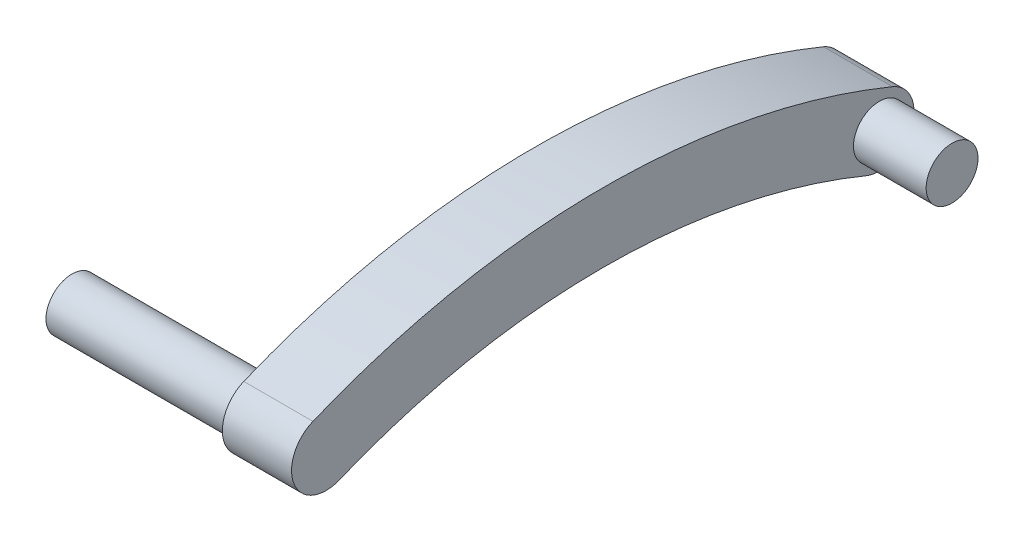
ISO-10303-21;
HEADER;
FILE_DESCRIPTION(('STEP AP214'),'2;1');
FILE_NAME('part.step','',(''),(''),'','','');
FILE_SCHEMA(('AUTOMOTIVE_DESIGN { 1 0 10303 214 1 1 1 1 }'));
ENDSEC;
DATA;
#1=APPLICATION_CONTEXT('core data for automotive mechanical design processes');
#2=APPLICATION_PROTOCOL_DEFINITION('international standard','automotive_design',2000,#1);
#3=PRODUCT_CONTEXT('',#1,'mechanical');
#4=PRODUCT('Part','Part','',(#3));
#5=PRODUCT_RELATED_PRODUCT_CATEGORY('part','',(#4));
#6=PRODUCT_DEFINITION_FORMATION('','',#4);
#7=PRODUCT_DEFINITION_CONTEXT('part definition',#1,'design');
#8=PRODUCT_DEFINITION('design','',#6,#7);
#9=PRODUCT_DEFINITION_SHAPE('','',#8);
#10=(LENGTH_UNIT() NAMED_UNIT(*) SI_UNIT(.MILLI.,.METRE.));
#11=(NAMED_UNIT(*) PLANE_ANGLE_UNIT() SI_UNIT($,.RADIAN.));
#12=(NAMED_UNIT(*) SI_UNIT($,.STERADIAN.) SOLID_ANGLE_UNIT());
#13=UNCERTAINTY_MEASURE_WITH_UNIT(LENGTH_MEASURE(1.E-05),#10,'distance_accuracy_value','');
#14=(GEOMETRIC_REPRESENTATION_CONTEXT(3) GLOBAL_UNCERTAINTY_ASSIGNED_CONTEXT((#13)) GLOBAL_UNIT_ASSIGNED_CONTEXT((#10,
#11,#12)) REPRESENTATION_CONTEXT('',''));
#15=CARTESIAN_POINT('',(0.,0.,0.));
#16=DIRECTION('',(0.,0.,1.));
#17=DIRECTION('',(1.,0.,0.));
#18=AXIS2_PLACEMENT_3D('',#15,#16,#17);
#19=CARTESIAN_POINT('',(4.,-38.8329756778952,-16.));
#20=DIRECTION('',(-1.,0.,0.));
#21=DIRECTION('',(0.,0.,1.));
#22=AXIS2_PLACEMENT_3D('',#19,#20,#21);
#23=CYLINDRICAL_SURFACE('',#22,44.);
#24=CARTESIAN_POINT('',(0.,-38.8329756778952,-16.));
#25=DIRECTION('',(1.,0.,0.));
#26=DIRECTION('',(0.,0.,1.));
#27=AXIS2_PLACEMENT_3D('',#24,#25,#26);
#28=CIRCLE('',#27,44.);
#29=CARTESIAN_POINT('',(0.,1.84918931799501,-32.7619047619048));
#30=VERTEX_POINT('',#29);
#31=CARTESIAN_POINT('',(0.,1.84918931799501,0.761904761904762));
#32=VERTEX_POINT('',#31);
#33=EDGE_CURVE('E112',#30,#32,#28,.T.);
#34=ORIENTED_EDGE('',*,*,#33,.T.);
#35=DIRECTION('',(-1.,0.,0.));
#36=VECTOR('',#35,1.);
#37=CARTESIAN_POINT('',(4.,1.84918931799501,0.761904761904762));
#38=LINE('',#37,#36);
#39=CARTESIAN_POINT('',(4.,1.84918931799501,0.761904761904762));
#40=VERTEX_POINT('',#39);
#41=EDGE_CURVE('E50',#40,#32,#38,.T.);
#42=ORIENTED_EDGE('',*,*,#41,.F.);
#43=CARTESIAN_POINT('',(4.,-38.8329756778952,-16.));
#44=DIRECTION('',(1.,0.,0.));
#45=DIRECTION('',(0.,0.,1.));
#46=AXIS2_PLACEMENT_3D('',#43,#44,#45);
#47=CIRCLE('',#46,44.);
#48=CARTESIAN_POINT('',(4.,1.84918931799501,-32.7619047619048));
#49=VERTEX_POINT('',#48);
#50=EDGE_CURVE('E94',#49,#40,#47,.T.);
#51=ORIENTED_EDGE('',*,*,#50,.F.);
#52=DIRECTION('',(-1.,0.,0.));
#53=VECTOR('',#52,1.);
#54=CARTESIAN_POINT('',(4.,1.84918931799501,-32.7619047619048));
#55=LINE('',#54,#53);
#56=EDGE_CURVE('E108',#49,#30,#55,.T.);
#57=ORIENTED_EDGE('',*,*,#56,.T.);
#58=EDGE_LOOP('',(#34,#42,#51,#57));
#59=FACE_BOUND('',#58,.T.);
#60=ADVANCED_FACE('F41',(#59),#23,.T.);
#61=CARTESIAN_POINT('',(4.,0.,0.));
#62=DIRECTION('',(-1.,0.,0.));
#63=DIRECTION('',(0.,0.,1.));
#64=AXIS2_PLACEMENT_3D('',#61,#62,#63);
#65=CYLINDRICAL_SURFACE('',#64,2.);
#66=CARTESIAN_POINT('',(0.,0.,0.));
#67=DIRECTION('',(1.,0.,0.));
#68=DIRECTION('',(0.,0.,-1.));
#69=AXIS2_PLACEMENT_3D('',#66,#67,#68);
#70=CIRCLE('',#69,2.);
#71=CARTESIAN_POINT('',(0.,-1.84918931799501,-0.761904761904762));
#72=VERTEX_POINT('',#71);
#73=EDGE_CURVE('E100',#32,#72,#70,.T.);
#74=ORIENTED_EDGE('',*,*,#73,.T.);
#75=DIRECTION('',(-1.,0.,0.));
#76=VECTOR('',#75,1.);
#77=CARTESIAN_POINT('',(4.,-1.84918931799501,-0.761904761904762));
#78=LINE('',#77,#76);
#79=CARTESIAN_POINT('',(4.,-1.84918931799501,-0.761904761904762));
#80=VERTEX_POINT('',#79);
#81=EDGE_CURVE('E98',#80,#72,#78,.T.);
#82=ORIENTED_EDGE('',*,*,#81,.F.);
#83=CARTESIAN_POINT('',(4.,0.,0.));
#84=DIRECTION('',(1.,0.,0.));
#85=DIRECTION('',(0.,0.,-1.));
#86=AXIS2_PLACEMENT_3D('',#83,#84,#85);
#87=CIRCLE('',#86,2.);
#88=EDGE_CURVE('E89',#40,#80,#87,.T.);
#89=ORIENTED_EDGE('',*,*,#88,.F.);
#90=ORIENTED_EDGE('',*,*,#41,.T.);
#91=EDGE_LOOP('',(#74,#82,#89,#90));
#92=FACE_BOUND('',#91,.T.);
#93=ADVANCED_FACE('F99',(#92),#65,.T.);
#94=CARTESIAN_POINT('',(4.,-38.8329756778952,-16.));
#95=DIRECTION('',(-1.,0.,0.));
#96=DIRECTION('',(0.,0.,1.));
#97=AXIS2_PLACEMENT_3D('',#94,#95,#96);
#98=CYLINDRICAL_SURFACE('',#97,40.);
#99=CARTESIAN_POINT('',(0.,-38.8329756778952,-16.));
#100=DIRECTION('',(-1.,0.,0.));
#101=DIRECTION('',(0.,0.,1.));
#102=AXIS2_PLACEMENT_3D('',#99,#100,#101);
#103=CIRCLE('',#102,40.);
#104=CARTESIAN_POINT('',(0.,-1.84918931799502,-31.2380952380952));
#105=VERTEX_POINT('',#104);
#106=EDGE_CURVE('E75',#72,#105,#103,.T.);
#107=ORIENTED_EDGE('',*,*,#106,.T.);
#108=DIRECTION('',(-1.,0.,0.));
#109=VECTOR('',#108,1.);
#110=CARTESIAN_POINT('',(4.,-1.84918931799502,-31.2380952380952));
#111=LINE('',#110,#109);
#112=CARTESIAN_POINT('',(4.,-1.84918931799502,-31.2380952380952));
#113=VERTEX_POINT('',#112);
#114=EDGE_CURVE('E102',#113,#105,#111,.T.);
#115=ORIENTED_EDGE('',*,*,#114,.F.);
#116=CARTESIAN_POINT('',(4.,-38.8329756778952,-16.));
#117=DIRECTION('',(-1.,0.,0.));
#118=DIRECTION('',(0.,0.,1.));
#119=AXIS2_PLACEMENT_3D('',#116,#117,#118);
#120=CIRCLE('',#119,40.);
#121=EDGE_CURVE('E92',#80,#113,#120,.T.);
#122=ORIENTED_EDGE('',*,*,#121,.F.);
#123=ORIENTED_EDGE('',*,*,#81,.T.);
#124=EDGE_LOOP('',(#107,#115,#122,#123));
#125=FACE_BOUND('',#124,.T.);
#126=ADVANCED_FACE('F104',(#125),#98,.F.);
#127=CARTESIAN_POINT('',(4.,0.,-32.));
#128=DIRECTION('',(-1.,0.,0.));
#129=DIRECTION('',(0.,0.,1.));
#130=AXIS2_PLACEMENT_3D('',#127,#128,#129);
#131=CYLINDRICAL_SURFACE('',#130,2.);
#132=CARTESIAN_POINT('',(0.,0.,-32.));
#133=DIRECTION('',(1.,0.,0.));
#134=DIRECTION('',(0.,0.,-1.));
#135=AXIS2_PLACEMENT_3D('',#132,#133,#134);
#136=CIRCLE('',#135,2.);
#137=EDGE_CURVE('E81',#105,#30,#136,.T.);
#138=ORIENTED_EDGE('',*,*,#137,.T.);
#139=ORIENTED_EDGE('',*,*,#56,.F.);
#140=CARTESIAN_POINT('',(4.,0.,-32.));
#141=DIRECTION('',(1.,0.,0.));
#142=DIRECTION('',(0.,0.,-1.));
#143=AXIS2_PLACEMENT_3D('',#140,#141,#142);
#144=CIRCLE('',#143,2.);
#145=EDGE_CURVE('E58',#113,#49,#144,.T.);
#146=ORIENTED_EDGE('',*,*,#145,.F.);
#147=ORIENTED_EDGE('',*,*,#114,.T.);
#148=EDGE_LOOP('',(#138,#139,#146,#147));
#149=FACE_BOUND('',#148,.T.);
#150=ADVANCED_FACE('F144',(#149),#131,.T.);
#151=CARTESIAN_POINT('',(4.,-19.4164878389476,-24.));
#152=DIRECTION('',(-1.,0.,0.));
#153=DIRECTION('',(0.,0.,1.));
#154=AXIS2_PLACEMENT_3D('',#151,#152,#153);
#155=PLANE('',#154);
#156=CARTESIAN_POINT('',(4.,0.,-32.));
#157=DIRECTION('',(-1.,0.,0.));
#158=DIRECTION('',(0.,0.,1.));
#159=AXIS2_PLACEMENT_3D('',#156,#157,#158);
#160=CIRCLE('',#159,1.5);
#161=CARTESIAN_POINT('',(4.,0.,-30.5));
#162=VERTEX_POINT('',#161);
#163=EDGE_CURVE('E11',#162,#162,#160,.F.);
#164=ORIENTED_EDGE('',*,*,#163,.F.);
#165=EDGE_LOOP('',(#164));
#166=FACE_BOUND('',#165,.T.);
#167=ORIENTED_EDGE('',*,*,#50,.T.);
#168=ORIENTED_EDGE('',*,*,#88,.T.);
#169=ORIENTED_EDGE('',*,*,#121,.T.);
#170=ORIENTED_EDGE('',*,*,#145,.T.);
#171=EDGE_LOOP('',(#167,#168,#169,#170));
#172=FACE_BOUND('',#171,.T.);
#173=ADVANCED_FACE('F90',(#166,#172),#155,.F.);
#174=CARTESIAN_POINT('',(0.,-19.4164878389476,-24.));
#175=DIRECTION('',(-1.,0.,0.));
#176=DIRECTION('',(0.,0.,1.));
#177=AXIS2_PLACEMENT_3D('',#174,#175,#176);
#178=PLANE('',#177);
#179=CARTESIAN_POINT('',(0.,0.,0.));
#180=DIRECTION('',(-1.,0.,0.));
#181=DIRECTION('',(0.,0.,1.));
#182=AXIS2_PLACEMENT_3D('',#179,#180,#181);
#183=CIRCLE('',#182,1.5);
#184=CARTESIAN_POINT('',(0.,0.,1.5));
#185=VERTEX_POINT('',#184);
#186=EDGE_CURVE('E197',#185,#185,#183,.T.);
#187=ORIENTED_EDGE('',*,*,#186,.F.);
#188=EDGE_LOOP('',(#187));
#189=FACE_BOUND('',#188,.T.);
#190=ORIENTED_EDGE('',*,*,#33,.F.);
#191=ORIENTED_EDGE('',*,*,#137,.F.);
#192=ORIENTED_EDGE('',*,*,#106,.F.);
#193=ORIENTED_EDGE('',*,*,#73,.F.);
#194=EDGE_LOOP('',(#190,#191,#192,#193));
#195=FACE_BOUND('',#194,.T.);
#196=ADVANCED_FACE('F130',(#189,#195),#178,.T.);
#197=CARTESIAN_POINT('',(8.2,0.,-32.));
#198=DIRECTION('',(-1.,0.,0.));
#199=DIRECTION('',(0.,0.,1.));
#200=AXIS2_PLACEMENT_3D('',#197,#198,#199);
#201=CYLINDRICAL_SURFACE('',#200,1.5);
#202=CARTESIAN_POINT('',(8.2,0.,-32.));
#203=DIRECTION('',(1.,0.,0.));
#204=DIRECTION('',(0.,0.,-1.));
#205=AXIS2_PLACEMENT_3D('',#202,#203,#204);
#206=CIRCLE('',#205,1.5);
#207=CARTESIAN_POINT('',(8.2,0.,-33.5));
#208=VERTEX_POINT('',#207);
#209=EDGE_CURVE('E116',#208,#208,#206,.T.);
#210=ORIENTED_EDGE('',*,*,#209,.F.);
#211=EDGE_LOOP('',(#210));
#212=FACE_BOUND('',#211,.T.);
#213=ORIENTED_EDGE('',*,*,#163,.T.);
#214=EDGE_LOOP('',(#213));
#215=FACE_BOUND('',#214,.T.);
#216=ADVANCED_FACE('F132',(#212,#215),#201,.T.);
#217=CARTESIAN_POINT('',(8.2,0.,-32.));
#218=DIRECTION('',(1.,0.,0.));
#219=DIRECTION('',(0.,0.,-1.));
#220=AXIS2_PLACEMENT_3D('',#217,#218,#219);
#221=PLANE('',#220);
#222=ORIENTED_EDGE('',*,*,#209,.T.);
#223=EDGE_LOOP('',(#222));
#224=FACE_BOUND('',#223,.T.);
#225=ADVANCED_FACE('F140',(#224),#221,.T.);
#226=CARTESIAN_POINT('',(-10.7,0.,0.));
#227=DIRECTION('',(1.,0.,0.));
#228=DIRECTION('',(0.,0.,-1.));
#229=AXIS2_PLACEMENT_3D('',#226,#227,#228);
#230=CYLINDRICAL_SURFACE('',#229,1.5);
#231=CARTESIAN_POINT('',(-10.7,0.,0.));
#232=DIRECTION('',(-1.,0.,0.));
#233=DIRECTION('',(0.,0.,1.));
#234=AXIS2_PLACEMENT_3D('',#231,#232,#233);
#235=CIRCLE('',#234,1.5);
#236=CARTESIAN_POINT('',(-10.7,0.,1.5));
#237=VERTEX_POINT('',#236);
#238=EDGE_CURVE('E195',#237,#237,#235,.T.);
#239=ORIENTED_EDGE('',*,*,#238,.F.);
#240=EDGE_LOOP('',(#239));
#241=FACE_BOUND('',#240,.T.);
#242=ORIENTED_EDGE('',*,*,#186,.T.);
#243=EDGE_LOOP('',(#242));
#244=FACE_BOUND('',#243,.T.);
#245=ADVANCED_FACE('F174',(#241,#244),#230,.T.);
#246=CARTESIAN_POINT('',(-10.7,0.,0.));
#247=DIRECTION('',(-1.,0.,0.));
#248=DIRECTION('',(0.,0.,1.));
#249=AXIS2_PLACEMENT_3D('',#246,#247,#248);
#250=PLANE('',#249);
#251=ORIENTED_EDGE('',*,*,#238,.T.);
#252=EDGE_LOOP('',(#251));
#253=FACE_BOUND('',#252,.T.);
#254=ADVANCED_FACE('F183',(#253),#250,.T.);
#255=CLOSED_SHELL('',(#60,#93,#126,#150,#173,#196,#216,#225,#245,#254));
#256=MANIFOLD_SOLID_BREP('B2',#255);
#257=ADVANCED_BREP_SHAPE_REPRESENTATION('',(#18,#256),#14);
#258=SHAPE_DEFINITION_REPRESENTATION(#9,#257);
ENDSEC;
END-ISO-10303-21;
